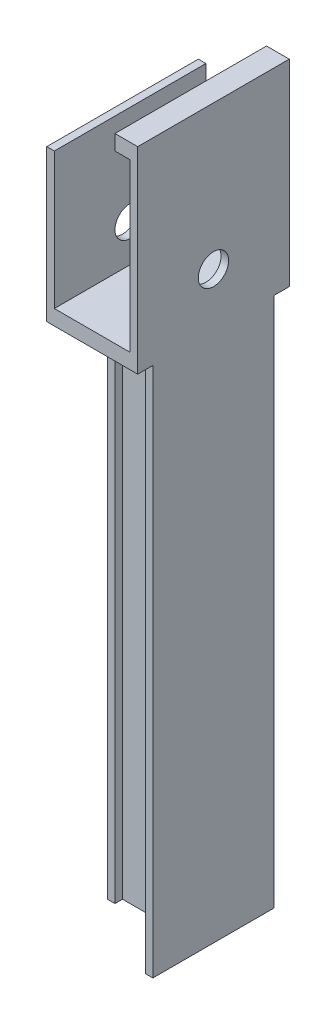
ISO-10303-21;
HEADER;
FILE_DESCRIPTION(('STEP AP214'),'2;1');
FILE_NAME('part.step','',(''),(''),'','','');
FILE_SCHEMA(('AUTOMOTIVE_DESIGN { 1 0 10303 214 1 1 1 1 }'));
ENDSEC;
DATA;
#1=APPLICATION_CONTEXT('core data for automotive mechanical design processes');
#2=APPLICATION_PROTOCOL_DEFINITION('international standard','automotive_design',2000,#1);
#3=PRODUCT_CONTEXT('',#1,'mechanical');
#4=PRODUCT('Part','Part','',(#3));
#5=PRODUCT_RELATED_PRODUCT_CATEGORY('part','',(#4));
#6=PRODUCT_DEFINITION_FORMATION('','',#4);
#7=PRODUCT_DEFINITION_CONTEXT('part definition',#1,'design');
#8=PRODUCT_DEFINITION('design','',#6,#7);
#9=PRODUCT_DEFINITION_SHAPE('','',#8);
#10=(LENGTH_UNIT() NAMED_UNIT(*) SI_UNIT(.MILLI.,.METRE.));
#11=(NAMED_UNIT(*) PLANE_ANGLE_UNIT() SI_UNIT($,.RADIAN.));
#12=(NAMED_UNIT(*) SI_UNIT($,.STERADIAN.) SOLID_ANGLE_UNIT());
#13=UNCERTAINTY_MEASURE_WITH_UNIT(LENGTH_MEASURE(1.E-05),#10,'distance_accuracy_value','');
#14=(GEOMETRIC_REPRESENTATION_CONTEXT(3) GLOBAL_UNCERTAINTY_ASSIGNED_CONTEXT((#13)) GLOBAL_UNIT_ASSIGNED_CONTEXT((#10,
#11,#12)) REPRESENTATION_CONTEXT('',''));
#15=CARTESIAN_POINT('',(0.,0.,0.));
#16=DIRECTION('',(0.,0.,1.));
#17=DIRECTION('',(1.,0.,0.));
#18=AXIS2_PLACEMENT_3D('',#15,#16,#17);
#19=CARTESIAN_POINT('',(-70.7317073170732,-350.,-89.2682926829269));
#20=DIRECTION('',(0.,0.,1.));
#21=DIRECTION('',(1.,0.,0.));
#22=AXIS2_PLACEMENT_3D('',#19,#20,#21);
#23=PLANE('',#22);
#24=DIRECTION('',(1.,0.,0.));
#25=VECTOR('',#24,1.);
#26=CARTESIAN_POINT('',(-70.7317073170732,-350.,-89.2682926829269));
#27=LINE('',#26,#25);
#28=CARTESIAN_POINT('',(-75.7317073170732,-350.,-89.2682926829269));
#29=VERTEX_POINT('',#28);
#30=CARTESIAN_POINT('',(-70.7317073170732,-350.,-89.2682926829269));
#31=VERTEX_POINT('',#30);
#32=EDGE_CURVE('E299',#29,#31,#27,.T.);
#33=ORIENTED_EDGE('',*,*,#32,.F.);
#34=DIRECTION('',(0.,-1.,0.));
#35=VECTOR('',#34,1.);
#36=CARTESIAN_POINT('',(-75.7317073170732,0.,-89.2682926829269));
#37=LINE('',#36,#35);
#38=CARTESIAN_POINT('',(-75.7317073170732,0.,-89.2682926829269));
#39=VERTEX_POINT('',#38);
#40=EDGE_CURVE('E212',#39,#29,#37,.T.);
#41=ORIENTED_EDGE('',*,*,#40,.F.);
#42=DIRECTION('',(1.,0.,0.));
#43=VECTOR('',#42,1.);
#44=CARTESIAN_POINT('',(-70.7317073170732,0.,-89.2682926829269));
#45=LINE('',#44,#43);
#46=CARTESIAN_POINT('',(-70.7317073170732,0.,-89.2682926829269));
#47=VERTEX_POINT('',#46);
#48=EDGE_CURVE('E295',#39,#47,#45,.T.);
#49=ORIENTED_EDGE('',*,*,#48,.T.);
#50=DIRECTION('',(0.,1.,0.));
#51=VECTOR('',#50,1.);
#52=CARTESIAN_POINT('',(-70.7317073170732,-350.,-89.2682926829269));
#53=LINE('',#52,#51);
#54=EDGE_CURVE('E301',#31,#47,#53,.T.);
#55=ORIENTED_EDGE('',*,*,#54,.F.);
#56=EDGE_LOOP('',(#33,#41,#49,#55));
#57=FACE_BOUND('',#56,.T.);
#58=ADVANCED_FACE('F39',(#57),#23,.F.);
#59=CARTESIAN_POINT('',(0.,0.,0.));
#60=DIRECTION('',(0.,1.,0.));
#61=DIRECTION('',(0.,0.,1.));
#62=AXIS2_PLACEMENT_3D('',#59,#60,#61);
#63=PLANE('',#62);
#64=DIRECTION('',(-1.,0.,0.));
#65=VECTOR('',#64,1.);
#66=CARTESIAN_POINT('',(-125.731707317073,0.,-59.2682926829269));
#67=LINE('',#66,#65);
#68=CARTESIAN_POINT('',(-125.731707317073,0.,-59.2682926829269));
#69=VERTEX_POINT('',#68);
#70=CARTESIAN_POINT('',(-130.731707317073,0.,-59.2682926829269));
#71=VERTEX_POINT('',#70);
#72=EDGE_CURVE('E218',#69,#71,#67,.T.);
#73=ORIENTED_EDGE('',*,*,#72,.T.);
#74=DIRECTION('',(0.,0.,1.));
#75=VECTOR('',#74,1.);
#76=CARTESIAN_POINT('',(-130.731707317073,0.,-99.2682926829269));
#77=LINE('',#76,#75);
#78=CARTESIAN_POINT('',(-130.731707317073,0.,-99.2682926829269));
#79=VERTEX_POINT('',#78);
#80=EDGE_CURVE('E196',#79,#71,#77,.T.);
#81=ORIENTED_EDGE('',*,*,#80,.F.);
#82=DIRECTION('',(-1.,0.,0.));
#83=VECTOR('',#82,1.);
#84=CARTESIAN_POINT('',(-130.731707317073,0.,-99.2682926829269));
#85=LINE('',#84,#83);
#86=CARTESIAN_POINT('',(-70.7317073170732,0.,-99.2682926829269));
#87=VERTEX_POINT('',#86);
#88=EDGE_CURVE('E352',#87,#79,#85,.T.);
#89=ORIENTED_EDGE('',*,*,#88,.F.);
#90=DIRECTION('',(0.,0.,-1.));
#91=VECTOR('',#90,1.);
#92=CARTESIAN_POINT('',(-70.7317073170732,0.,-99.2682926829269));
#93=LINE('',#92,#91);
#94=EDGE_CURVE('E359',#47,#87,#93,.T.);
#95=ORIENTED_EDGE('',*,*,#94,.F.);
#96=ORIENTED_EDGE('',*,*,#48,.F.);
#97=DIRECTION('',(0.,0.,1.));
#98=VECTOR('',#97,1.);
#99=CARTESIAN_POINT('',(-75.7317073170732,0.,-54.2682926829269));
#100=LINE('',#99,#98);
#101=CARTESIAN_POINT('',(-75.7317073170732,0.,-54.2682926829269));
#102=VERTEX_POINT('',#101);
#103=EDGE_CURVE('E259',#39,#102,#100,.T.);
#104=ORIENTED_EDGE('',*,*,#103,.T.);
#105=DIRECTION('',(-1.,0.,0.));
#106=VECTOR('',#105,1.);
#107=CARTESIAN_POINT('',(-125.731707317073,0.,-54.2682926829269));
#108=LINE('',#107,#106);
#109=CARTESIAN_POINT('',(-125.731707317073,0.,-54.2682926829269));
#110=VERTEX_POINT('',#109);
#111=EDGE_CURVE('E265',#102,#110,#108,.T.);
#112=ORIENTED_EDGE('',*,*,#111,.T.);
#113=DIRECTION('',(0.,0.,-1.));
#114=VECTOR('',#113,1.);
#115=CARTESIAN_POINT('',(-125.731707317073,0.,-54.2682926829269));
#116=LINE('',#115,#114);
#117=EDGE_CURVE('E251',#110,#69,#116,.T.);
#118=ORIENTED_EDGE('',*,*,#117,.T.);
#119=EDGE_LOOP('',(#73,#81,#89,#95,#96,#104,#112,#118));
#120=FACE_BOUND('',#119,.T.);
#121=ADVANCED_FACE('F392',(#120),#63,.F.);
#122=CARTESIAN_POINT('',(-130.731707317073,0.,-39.2682926829269));
#123=VERTEX_POINT('',#122);
#124=CARTESIAN_POINT('',(-130.731707317073,0.,0.73170731707313));
#125=VERTEX_POINT('',#124);
#126=EDGE_CURVE('E189',#123,#125,#77,.T.);
#127=ORIENTED_EDGE('',*,*,#126,.F.);
#128=DIRECTION('',(1.,0.,0.));
#129=VECTOR('',#128,1.);
#130=CARTESIAN_POINT('',(-125.731707317073,0.,-39.2682926829269));
#131=LINE('',#130,#129);
#132=CARTESIAN_POINT('',(-125.731707317073,0.,-39.2682926829269));
#133=VERTEX_POINT('',#132);
#134=EDGE_CURVE('E55',#123,#133,#131,.T.);
#135=ORIENTED_EDGE('',*,*,#134,.T.);
#136=DIRECTION('',(0.,0.,-1.));
#137=VECTOR('',#136,1.);
#138=CARTESIAN_POINT('',(-125.731707317073,0.,-9.26829268292688));
#139=LINE('',#138,#137);
#140=CARTESIAN_POINT('',(-125.731707317073,0.,-44.2682926829269));
#141=VERTEX_POINT('',#140);
#142=EDGE_CURVE('E225',#133,#141,#139,.T.);
#143=ORIENTED_EDGE('',*,*,#142,.T.);
#144=DIRECTION('',(1.,0.,0.));
#145=VECTOR('',#144,1.);
#146=CARTESIAN_POINT('',(-125.731707317073,0.,-44.2682926829269));
#147=LINE('',#146,#145);
#148=CARTESIAN_POINT('',(-75.7317073170732,0.,-44.2682926829269));
#149=VERTEX_POINT('',#148);
#150=EDGE_CURVE('E227',#141,#149,#147,.T.);
#151=ORIENTED_EDGE('',*,*,#150,.T.);
#152=DIRECTION('',(0.,0.,1.));
#153=VECTOR('',#152,1.);
#154=CARTESIAN_POINT('',(-75.7317073170732,0.,-9.26829268292687));
#155=LINE('',#154,#153);
#156=CARTESIAN_POINT('',(-75.7317073170732,0.,-9.26829268292687));
#157=VERTEX_POINT('',#156);
#158=EDGE_CURVE('E231',#149,#157,#155,.T.);
#159=ORIENTED_EDGE('',*,*,#158,.T.);
#160=DIRECTION('',(-1.,0.,0.));
#161=VECTOR('',#160,1.);
#162=CARTESIAN_POINT('',(-70.7317073170732,0.,-9.26829268292688));
#163=LINE('',#162,#161);
#164=CARTESIAN_POINT('',(-70.7317073170732,0.,-9.26829268292688));
#165=VERTEX_POINT('',#164);
#166=EDGE_CURVE('E290',#165,#157,#163,.T.);
#167=ORIENTED_EDGE('',*,*,#166,.F.);
#168=CARTESIAN_POINT('',(-70.7317073170732,0.,0.73170731707313));
#169=VERTEX_POINT('',#168);
#170=EDGE_CURVE('E360',#169,#165,#93,.T.);
#171=ORIENTED_EDGE('',*,*,#170,.F.);
#172=DIRECTION('',(1.,0.,0.));
#173=VECTOR('',#172,1.);
#174=CARTESIAN_POINT('',(-130.731707317073,0.,0.73170731707313));
#175=LINE('',#174,#173);
#176=EDGE_CURVE('E192',#125,#169,#175,.T.);
#177=ORIENTED_EDGE('',*,*,#176,.F.);
#178=EDGE_LOOP('',(#127,#135,#143,#151,#159,#167,#171,#177));
#179=FACE_BOUND('',#178,.T.);
#180=ADVANCED_FACE('F190',(#179),#63,.F.);
#181=CARTESIAN_POINT('',(-75.7317073170732,60.,-99.2682926829269));
#182=DIRECTION('',(1.,0.,0.));
#183=DIRECTION('',(0.,0.,-1.));
#184=AXIS2_PLACEMENT_3D('',#181,#182,#183);
#185=PLANE('',#184);
#186=CARTESIAN_POINT('',(-75.7317073170732,35.,-49.2682926829269));
#187=DIRECTION('',(1.,0.,0.));
#188=DIRECTION('',(0.,0.,-1.));
#189=AXIS2_PLACEMENT_3D('',#186,#187,#188);
#190=CIRCLE('',#189,10.);
#191=CARTESIAN_POINT('',(-75.7317073170732,35.,-59.2682926829269));
#192=VERTEX_POINT('',#191);
#193=EDGE_CURVE('E275',#192,#192,#190,.T.);
#194=ORIENTED_EDGE('',*,*,#193,.T.);
#195=EDGE_LOOP('',(#194));
#196=FACE_BOUND('',#195,.T.);
#197=DIRECTION('',(0.,0.,1.));
#198=VECTOR('',#197,1.);
#199=CARTESIAN_POINT('',(-75.7317073170732,120.,-99.2682926829269));
#200=LINE('',#199,#198);
#201=CARTESIAN_POINT('',(-75.7317073170732,120.,-99.2682926829269));
#202=VERTEX_POINT('',#201);
#203=CARTESIAN_POINT('',(-75.7317073170732,120.,0.73170731707313));
#204=VERTEX_POINT('',#203);
#205=EDGE_CURVE('E310',#202,#204,#200,.T.);
#206=ORIENTED_EDGE('',*,*,#205,.F.);
#207=DIRECTION('',(0.,1.,0.));
#208=VECTOR('',#207,1.);
#209=CARTESIAN_POINT('',(-75.7317073170732,60.,-99.2682926829269));
#210=LINE('',#209,#208);
#211=CARTESIAN_POINT('',(-75.7317073170732,10.,-99.2682926829269));
#212=VERTEX_POINT('',#211);
#213=EDGE_CURVE('E340',#212,#202,#210,.T.);
#214=ORIENTED_EDGE('',*,*,#213,.F.);
#215=DIRECTION('',(0.,0.,-1.));
#216=VECTOR('',#215,1.);
#217=CARTESIAN_POINT('',(-75.7317073170732,10.,-99.2682926829269));
#218=LINE('',#217,#216);
#219=CARTESIAN_POINT('',(-75.7317073170732,10.,0.73170731707313));
#220=VERTEX_POINT('',#219);
#221=EDGE_CURVE('E284',#220,#212,#218,.T.);
#222=ORIENTED_EDGE('',*,*,#221,.F.);
#223=DIRECTION('',(0.,1.,0.));
#224=VECTOR('',#223,1.);
#225=CARTESIAN_POINT('',(-75.7317073170732,60.,0.73170731707313));
#226=LINE('',#225,#224);
#227=EDGE_CURVE('E343',#220,#204,#226,.T.);
#228=ORIENTED_EDGE('',*,*,#227,.T.);
#229=EDGE_LOOP('',(#206,#214,#222,#228));
#230=FACE_BOUND('',#229,.T.);
#231=ADVANCED_FACE('F413',(#196,#230),#185,.F.);
#232=CARTESIAN_POINT('',(0.,100.,0.));
#233=DIRECTION('',(0.,1.,0.));
#234=DIRECTION('',(0.,0.,1.));
#235=AXIS2_PLACEMENT_3D('',#232,#233,#234);
#236=PLANE('',#235);
#237=DIRECTION('',(0.,0.,1.));
#238=VECTOR('',#237,1.);
#239=CARTESIAN_POINT('',(-125.731707317073,100.,-99.2682926829269));
#240=LINE('',#239,#238);
#241=CARTESIAN_POINT('',(-125.731707317073,100.,-99.2682926829269));
#242=VERTEX_POINT('',#241);
#243=CARTESIAN_POINT('',(-125.731707317073,100.,0.73170731707313));
#244=VERTEX_POINT('',#243);
#245=EDGE_CURVE('E336',#242,#244,#240,.T.);
#246=ORIENTED_EDGE('',*,*,#245,.F.);
#247=DIRECTION('',(-1.,0.,0.));
#248=VECTOR('',#247,1.);
#249=CARTESIAN_POINT('',(-130.731707317073,100.,-99.2682926829269));
#250=LINE('',#249,#248);
#251=CARTESIAN_POINT('',(-130.731707317073,100.,-99.2682926829269));
#252=VERTEX_POINT('',#251);
#253=EDGE_CURVE('E355',#242,#252,#250,.T.);
#254=ORIENTED_EDGE('',*,*,#253,.T.);
#255=DIRECTION('',(0.,0.,1.));
#256=VECTOR('',#255,1.);
#257=CARTESIAN_POINT('',(-130.731707317073,100.,-99.2682926829269));
#258=LINE('',#257,#256);
#259=CARTESIAN_POINT('',(-130.731707317073,100.,0.73170731707313));
#260=VERTEX_POINT('',#259);
#261=EDGE_CURVE('E348',#252,#260,#258,.T.);
#262=ORIENTED_EDGE('',*,*,#261,.T.);
#263=DIRECTION('',(1.,0.,0.));
#264=VECTOR('',#263,1.);
#265=CARTESIAN_POINT('',(-130.731707317073,100.,0.73170731707313));
#266=LINE('',#265,#264);
#267=EDGE_CURVE('E351',#260,#244,#266,.T.);
#268=ORIENTED_EDGE('',*,*,#267,.T.);
#269=EDGE_LOOP('',(#246,#254,#262,#268));
#270=FACE_BOUND('',#269,.T.);
#271=ADVANCED_FACE('F421',(#270),#236,.T.);
#272=CARTESIAN_POINT('',(-130.731707317073,100.,-99.2682926829269));
#273=DIRECTION('',(1.,0.,0.));
#274=DIRECTION('',(0.,0.,-1.));
#275=AXIS2_PLACEMENT_3D('',#272,#273,#274);
#276=PLANE('',#275);
#277=CARTESIAN_POINT('',(-130.731707317073,35.,-49.2682926829269));
#278=DIRECTION('',(-1.,0.,0.));
#279=DIRECTION('',(0.,0.,1.));
#280=AXIS2_PLACEMENT_3D('',#277,#278,#279);
#281=CIRCLE('',#280,10.);
#282=CARTESIAN_POINT('',(-130.731707317073,35.,-39.2682926829269));
#283=VERTEX_POINT('',#282);
#284=EDGE_CURVE('E244',#283,#283,#281,.T.);
#285=ORIENTED_EDGE('',*,*,#284,.F.);
#286=EDGE_LOOP('',(#285));
#287=FACE_BOUND('',#286,.T.);
#288=DIRECTION('',(0.,0.,-1.));
#289=VECTOR('',#288,1.);
#290=CARTESIAN_POINT('',(-130.731707317073,-350.,-89.2682926829269));
#291=LINE('',#290,#289);
#292=CARTESIAN_POINT('',(-130.731707317073,-350.,-39.2682926829269));
#293=VERTEX_POINT('',#292);
#294=CARTESIAN_POINT('',(-130.731707317073,-350.,-59.2682926829269));
#295=VERTEX_POINT('',#294);
#296=EDGE_CURVE('E210',#293,#295,#291,.T.);
#297=ORIENTED_EDGE('',*,*,#296,.F.);
#298=DIRECTION('',(0.,-1.,0.));
#299=VECTOR('',#298,1.);
#300=CARTESIAN_POINT('',(-130.731707317073,0.,-39.2682926829269));
#301=LINE('',#300,#299);
#302=EDGE_CURVE('E201',#123,#293,#301,.T.);
#303=ORIENTED_EDGE('',*,*,#302,.F.);
#304=ORIENTED_EDGE('',*,*,#126,.T.);
#305=DIRECTION('',(0.,-1.,0.));
#306=VECTOR('',#305,1.);
#307=CARTESIAN_POINT('',(-130.731707317073,100.,0.73170731707313));
#308=LINE('',#307,#306);
#309=EDGE_CURVE('E11',#260,#125,#308,.T.);
#310=ORIENTED_EDGE('',*,*,#309,.F.);
#311=ORIENTED_EDGE('',*,*,#261,.F.);
#312=DIRECTION('',(0.,-1.,0.));
#313=VECTOR('',#312,1.);
#314=CARTESIAN_POINT('',(-130.731707317073,100.,-99.2682926829269));
#315=LINE('',#314,#313);
#316=EDGE_CURVE('E356',#252,#79,#315,.T.);
#317=ORIENTED_EDGE('',*,*,#316,.T.);
#318=ORIENTED_EDGE('',*,*,#80,.T.);
#319=DIRECTION('',(0.,-1.,0.));
#320=VECTOR('',#319,1.);
#321=CARTESIAN_POINT('',(-130.731707317073,0.,-59.2682926829269));
#322=LINE('',#321,#320);
#323=EDGE_CURVE('E219',#71,#295,#322,.T.);
#324=ORIENTED_EDGE('',*,*,#323,.T.);
#325=EDGE_LOOP('',(#297,#303,#304,#310,#311,#317,#318,#324));
#326=FACE_BOUND('',#325,.T.);
#327=ADVANCED_FACE('F41',(#287,#326),#276,.F.);
#328=CARTESIAN_POINT('',(-130.731707317073,100.,0.73170731707313));
#329=DIRECTION('',(0.,0.,-1.));
#330=DIRECTION('',(-1.,0.,0.));
#331=AXIS2_PLACEMENT_3D('',#328,#329,#330);
#332=PLANE('',#331);
#333=DIRECTION('',(1.,0.,0.));
#334=VECTOR('',#333,1.);
#335=CARTESIAN_POINT('',(-125.731707317073,10.,0.73170731707313));
#336=LINE('',#335,#334);
#337=CARTESIAN_POINT('',(-125.731707317073,10.,0.73170731707313));
#338=VERTEX_POINT('',#337);
#339=EDGE_CURVE('E281',#338,#220,#336,.T.);
#340=ORIENTED_EDGE('',*,*,#339,.F.);
#341=DIRECTION('',(0.,1.,0.));
#342=VECTOR('',#341,1.);
#343=CARTESIAN_POINT('',(-125.731707317073,60.,0.73170731707313));
#344=LINE('',#343,#342);
#345=EDGE_CURVE('E338',#338,#244,#344,.T.);
#346=ORIENTED_EDGE('',*,*,#345,.T.);
#347=ORIENTED_EDGE('',*,*,#267,.F.);
#348=ORIENTED_EDGE('',*,*,#309,.T.);
#349=ORIENTED_EDGE('',*,*,#176,.T.);
#350=DIRECTION('',(0.,-1.,0.));
#351=VECTOR('',#350,1.);
#352=CARTESIAN_POINT('',(-70.7317073170732,100.,0.73170731707313));
#353=LINE('',#352,#351);
#354=CARTESIAN_POINT('',(-70.7317073170732,130.,0.73170731707313));
#355=VERTEX_POINT('',#354);
#356=EDGE_CURVE('E48',#355,#169,#353,.T.);
#357=ORIENTED_EDGE('',*,*,#356,.F.);
#358=DIRECTION('',(1.,0.,0.));
#359=VECTOR('',#358,1.);
#360=CARTESIAN_POINT('',(-75.7317073170732,130.,0.73170731707313));
#361=LINE('',#360,#359);
#362=CARTESIAN_POINT('',(-85.7317073170732,130.,0.731707317073128));
#363=VERTEX_POINT('',#362);
#364=EDGE_CURVE('E328',#363,#355,#361,.T.);
#365=ORIENTED_EDGE('',*,*,#364,.F.);
#366=DIRECTION('',(0.,1.,0.));
#367=VECTOR('',#366,1.);
#368=CARTESIAN_POINT('',(-85.7317073170732,130.,0.731707317073128));
#369=LINE('',#368,#367);
#370=CARTESIAN_POINT('',(-85.7317073170732,120.,0.731707317073131));
#371=VERTEX_POINT('',#370);
#372=EDGE_CURVE('E316',#371,#363,#369,.T.);
#373=ORIENTED_EDGE('',*,*,#372,.F.);
#374=DIRECTION('',(1.,0.,0.));
#375=VECTOR('',#374,1.);
#376=CARTESIAN_POINT('',(-85.7317073170732,120.,0.731707317073131));
#377=LINE('',#376,#375);
#378=EDGE_CURVE('E322',#371,#204,#377,.T.);
#379=ORIENTED_EDGE('',*,*,#378,.T.);
#380=ORIENTED_EDGE('',*,*,#227,.F.);
#381=EDGE_LOOP('',(#340,#346,#347,#348,#349,#357,#365,#373,#379,#380));
#382=FACE_BOUND('',#381,.T.);
#383=ADVANCED_FACE('F408',(#382),#332,.F.);
#384=CARTESIAN_POINT('',(-70.7317073170732,100.,-99.2682926829269));
#385=DIRECTION('',(-1.,0.,0.));
#386=DIRECTION('',(0.,0.,1.));
#387=AXIS2_PLACEMENT_3D('',#384,#385,#386);
#388=PLANE('',#387);
#389=CARTESIAN_POINT('',(-70.7317073170732,35.,-49.2682926829269));
#390=DIRECTION('',(-1.,0.,0.));
#391=DIRECTION('',(0.,0.,1.));
#392=AXIS2_PLACEMENT_3D('',#389,#390,#391);
#393=CIRCLE('',#392,10.);
#394=CARTESIAN_POINT('',(-70.7317073170732,35.,-39.2682926829269));
#395=VERTEX_POINT('',#394);
#396=EDGE_CURVE('E272',#395,#395,#393,.T.);
#397=ORIENTED_EDGE('',*,*,#396,.T.);
#398=EDGE_LOOP('',(#397));
#399=FACE_BOUND('',#398,.T.);
#400=ORIENTED_EDGE('',*,*,#170,.T.);
#401=DIRECTION('',(0.,1.,0.));
#402=VECTOR('',#401,1.);
#403=CARTESIAN_POINT('',(-70.7317073170732,-350.,-9.26829268292688));
#404=LINE('',#403,#402);
#405=CARTESIAN_POINT('',(-70.7317073170732,-350.,-9.26829268292688));
#406=VERTEX_POINT('',#405);
#407=EDGE_CURVE('E307',#406,#165,#404,.T.);
#408=ORIENTED_EDGE('',*,*,#407,.F.);
#409=DIRECTION('',(0.,0.,1.));
#410=VECTOR('',#409,1.);
#411=CARTESIAN_POINT('',(-70.7317073170732,-350.,-89.2682926829269));
#412=LINE('',#411,#410);
#413=EDGE_CURVE('E291',#31,#406,#412,.T.);
#414=ORIENTED_EDGE('',*,*,#413,.F.);
#415=ORIENTED_EDGE('',*,*,#54,.T.);
#416=ORIENTED_EDGE('',*,*,#94,.T.);
#417=DIRECTION('',(0.,-1.,0.));
#418=VECTOR('',#417,1.);
#419=CARTESIAN_POINT('',(-70.7317073170732,100.,-99.2682926829269));
#420=LINE('',#419,#418);
#421=CARTESIAN_POINT('',(-70.7317073170732,130.,-99.2682926829269));
#422=VERTEX_POINT('',#421);
#423=EDGE_CURVE('E366',#422,#87,#420,.T.);
#424=ORIENTED_EDGE('',*,*,#423,.F.);
#425=DIRECTION('',(0.,0.,-1.));
#426=VECTOR('',#425,1.);
#427=CARTESIAN_POINT('',(-70.7317073170732,130.,-99.2682926829269));
#428=LINE('',#427,#426);
#429=EDGE_CURVE('E331',#355,#422,#428,.T.);
#430=ORIENTED_EDGE('',*,*,#429,.F.);
#431=ORIENTED_EDGE('',*,*,#356,.T.);
#432=EDGE_LOOP('',(#400,#408,#414,#415,#416,#424,#430,#431));
#433=FACE_BOUND('',#432,.T.);
#434=ADVANCED_FACE('F372',(#399,#433),#388,.F.);
#435=CARTESIAN_POINT('',(-130.731707317073,100.,-99.2682926829269));
#436=DIRECTION('',(0.,0.,1.));
#437=DIRECTION('',(1.,0.,0.));
#438=AXIS2_PLACEMENT_3D('',#435,#436,#437);
#439=PLANE('',#438);
#440=DIRECTION('',(0.,1.,0.));
#441=VECTOR('',#440,1.);
#442=CARTESIAN_POINT('',(-125.731707317073,60.,-99.2682926829269));
#443=LINE('',#442,#441);
#444=CARTESIAN_POINT('',(-125.731707317073,10.,-99.2682926829269));
#445=VERTEX_POINT('',#444);
#446=EDGE_CURVE('E197',#445,#242,#443,.T.);
#447=ORIENTED_EDGE('',*,*,#446,.F.);
#448=DIRECTION('',(-1.,0.,0.));
#449=VECTOR('',#448,1.);
#450=CARTESIAN_POINT('',(-125.731707317073,10.,-99.2682926829269));
#451=LINE('',#450,#449);
#452=EDGE_CURVE('E287',#212,#445,#451,.T.);
#453=ORIENTED_EDGE('',*,*,#452,.F.);
#454=ORIENTED_EDGE('',*,*,#213,.T.);
#455=DIRECTION('',(1.,0.,0.));
#456=VECTOR('',#455,1.);
#457=CARTESIAN_POINT('',(-85.7317073170732,120.,-99.2682926829269));
#458=LINE('',#457,#456);
#459=CARTESIAN_POINT('',(-85.7317073170732,120.,-99.2682926829269));
#460=VERTEX_POINT('',#459);
#461=EDGE_CURVE('E326',#460,#202,#458,.T.);
#462=ORIENTED_EDGE('',*,*,#461,.F.);
#463=DIRECTION('',(0.,-1.,0.));
#464=VECTOR('',#463,1.);
#465=CARTESIAN_POINT('',(-85.7317073170732,130.,-99.2682926829269));
#466=LINE('',#465,#464);
#467=CARTESIAN_POINT('',(-85.7317073170732,130.,-99.2682926829269));
#468=VERTEX_POINT('',#467);
#469=EDGE_CURVE('E311',#468,#460,#466,.T.);
#470=ORIENTED_EDGE('',*,*,#469,.F.);
#471=DIRECTION('',(-1.,0.,0.));
#472=VECTOR('',#471,1.);
#473=CARTESIAN_POINT('',(-75.7317073170732,130.,-99.2682926829269));
#474=LINE('',#473,#472);
#475=EDGE_CURVE('E334',#422,#468,#474,.T.);
#476=ORIENTED_EDGE('',*,*,#475,.F.);
#477=ORIENTED_EDGE('',*,*,#423,.T.);
#478=ORIENTED_EDGE('',*,*,#88,.T.);
#479=ORIENTED_EDGE('',*,*,#316,.F.);
#480=ORIENTED_EDGE('',*,*,#253,.F.);
#481=EDGE_LOOP('',(#447,#453,#454,#462,#470,#476,#477,#478,#479,#480));
#482=FACE_BOUND('',#481,.T.);
#483=ADVANCED_FACE('F396',(#482),#439,.F.);
#484=CARTESIAN_POINT('',(-125.731707317073,60.,-99.2682926829269));
#485=DIRECTION('',(-1.,0.,0.));
#486=DIRECTION('',(0.,0.,1.));
#487=AXIS2_PLACEMENT_3D('',#484,#485,#486);
#488=PLANE('',#487);
#489=CARTESIAN_POINT('',(-125.731707317073,35.,-49.2682926829269));
#490=DIRECTION('',(-1.,0.,0.));
#491=DIRECTION('',(0.,0.,1.));
#492=AXIS2_PLACEMENT_3D('',#489,#490,#491);
#493=CIRCLE('',#492,10.);
#494=CARTESIAN_POINT('',(-125.731707317073,35.,-39.2682926829269));
#495=VERTEX_POINT('',#494);
#496=EDGE_CURVE('E43',#495,#495,#493,.T.);
#497=ORIENTED_EDGE('',*,*,#496,.T.);
#498=EDGE_LOOP('',(#497));
#499=FACE_BOUND('',#498,.T.);
#500=ORIENTED_EDGE('',*,*,#245,.T.);
#501=ORIENTED_EDGE('',*,*,#345,.F.);
#502=DIRECTION('',(0.,0.,1.));
#503=VECTOR('',#502,1.);
#504=CARTESIAN_POINT('',(-125.731707317073,10.,-99.2682926829269));
#505=LINE('',#504,#503);
#506=EDGE_CURVE('E278',#445,#338,#505,.T.);
#507=ORIENTED_EDGE('',*,*,#506,.F.);
#508=ORIENTED_EDGE('',*,*,#446,.T.);
#509=EDGE_LOOP('',(#500,#501,#507,#508));
#510=FACE_BOUND('',#509,.T.);
#511=ADVANCED_FACE('F470',(#499,#510),#488,.F.);
#512=CARTESIAN_POINT('',(0.,130.,0.));
#513=DIRECTION('',(0.,1.,0.));
#514=DIRECTION('',(0.,0.,1.));
#515=AXIS2_PLACEMENT_3D('',#512,#513,#514);
#516=PLANE('',#515);
#517=ORIENTED_EDGE('',*,*,#475,.T.);
#518=DIRECTION('',(0.,0.,-1.));
#519=VECTOR('',#518,1.);
#520=CARTESIAN_POINT('',(-85.7317073170732,130.,-99.2682926829269));
#521=LINE('',#520,#519);
#522=EDGE_CURVE('E319',#363,#468,#521,.T.);
#523=ORIENTED_EDGE('',*,*,#522,.F.);
#524=ORIENTED_EDGE('',*,*,#364,.T.);
#525=ORIENTED_EDGE('',*,*,#429,.T.);
#526=EDGE_LOOP('',(#517,#523,#524,#525));
#527=FACE_BOUND('',#526,.T.);
#528=ADVANCED_FACE('F402',(#527),#516,.T.);
#529=CARTESIAN_POINT('',(-85.7317073170732,120.,-99.2682926829269));
#530=DIRECTION('',(0.,1.,0.));
#531=DIRECTION('',(0.,0.,1.));
#532=AXIS2_PLACEMENT_3D('',#529,#530,#531);
#533=PLANE('',#532);
#534=ORIENTED_EDGE('',*,*,#205,.T.);
#535=ORIENTED_EDGE('',*,*,#378,.F.);
#536=DIRECTION('',(0.,0.,1.));
#537=VECTOR('',#536,1.);
#538=CARTESIAN_POINT('',(-85.7317073170732,120.,-99.2682926829269));
#539=LINE('',#538,#537);
#540=EDGE_CURVE('E314',#460,#371,#539,.T.);
#541=ORIENTED_EDGE('',*,*,#540,.F.);
#542=ORIENTED_EDGE('',*,*,#461,.T.);
#543=EDGE_LOOP('',(#534,#535,#541,#542));
#544=FACE_BOUND('',#543,.T.);
#545=ADVANCED_FACE('F465',(#544),#533,.F.);
#546=CARTESIAN_POINT('',(-85.7317073170732,0.,0.));
#547=DIRECTION('',(-1.,0.,0.));
#548=DIRECTION('',(0.,0.,1.));
#549=AXIS2_PLACEMENT_3D('',#546,#547,#548);
#550=PLANE('',#549);
#551=ORIENTED_EDGE('',*,*,#469,.T.);
#552=ORIENTED_EDGE('',*,*,#540,.T.);
#553=ORIENTED_EDGE('',*,*,#372,.T.);
#554=ORIENTED_EDGE('',*,*,#522,.T.);
#555=EDGE_LOOP('',(#551,#552,#553,#554));
#556=FACE_BOUND('',#555,.T.);
#557=ADVANCED_FACE('F404',(#556),#550,.T.);
#558=CARTESIAN_POINT('',(-70.7317073170732,-350.,-9.26829268292688));
#559=DIRECTION('',(0.,0.,-1.));
#560=DIRECTION('',(-1.,0.,0.));
#561=AXIS2_PLACEMENT_3D('',#558,#559,#560);
#562=PLANE('',#561);
#563=ORIENTED_EDGE('',*,*,#166,.T.);
#564=DIRECTION('',(0.,-1.,0.));
#565=VECTOR('',#564,1.);
#566=CARTESIAN_POINT('',(-75.7317073170732,0.,-9.26829268292687));
#567=LINE('',#566,#565);
#568=CARTESIAN_POINT('',(-75.7317073170732,-350.,-9.26829268292687));
#569=VERTEX_POINT('',#568);
#570=EDGE_CURVE('E241',#157,#569,#567,.T.);
#571=ORIENTED_EDGE('',*,*,#570,.T.);
#572=DIRECTION('',(-1.,0.,0.));
#573=VECTOR('',#572,1.);
#574=CARTESIAN_POINT('',(-70.7317073170732,-350.,-9.26829268292688));
#575=LINE('',#574,#573);
#576=EDGE_CURVE('E294',#406,#569,#575,.T.);
#577=ORIENTED_EDGE('',*,*,#576,.F.);
#578=ORIENTED_EDGE('',*,*,#407,.T.);
#579=EDGE_LOOP('',(#563,#571,#577,#578));
#580=FACE_BOUND('',#579,.T.);
#581=ADVANCED_FACE('F377',(#580),#562,.F.);
#582=CARTESIAN_POINT('',(0.,-350.,0.));
#583=DIRECTION('',(0.,-1.,0.));
#584=DIRECTION('',(0.,0.,-1.));
#585=AXIS2_PLACEMENT_3D('',#582,#583,#584);
#586=PLANE('',#585);
#587=DIRECTION('',(1.,0.,0.));
#588=VECTOR('',#587,1.);
#589=CARTESIAN_POINT('',(-125.731707317073,-350.,-39.2682926829269));
#590=LINE('',#589,#588);
#591=CARTESIAN_POINT('',(-125.731707317073,-350.,-39.2682926829269));
#592=VERTEX_POINT('',#591);
#593=EDGE_CURVE('E205',#293,#592,#590,.T.);
#594=ORIENTED_EDGE('',*,*,#593,.F.);
#595=ORIENTED_EDGE('',*,*,#296,.T.);
#596=DIRECTION('',(-1.,0.,0.));
#597=VECTOR('',#596,1.);
#598=CARTESIAN_POINT('',(-125.731707317073,-350.,-59.2682926829269));
#599=LINE('',#598,#597);
#600=CARTESIAN_POINT('',(-125.731707317073,-350.,-59.2682926829269));
#601=VERTEX_POINT('',#600);
#602=EDGE_CURVE('E221',#601,#295,#599,.T.);
#603=ORIENTED_EDGE('',*,*,#602,.F.);
#604=DIRECTION('',(0.,0.,-1.));
#605=VECTOR('',#604,1.);
#606=CARTESIAN_POINT('',(-125.731707317073,-350.,-54.2682926829269));
#607=LINE('',#606,#605);
#608=CARTESIAN_POINT('',(-125.731707317073,-350.,-54.2682926829269));
#609=VERTEX_POINT('',#608);
#610=EDGE_CURVE('E255',#609,#601,#607,.T.);
#611=ORIENTED_EDGE('',*,*,#610,.F.);
#612=DIRECTION('',(-1.,0.,0.));
#613=VECTOR('',#612,1.);
#614=CARTESIAN_POINT('',(-125.731707317073,-350.,-54.2682926829269));
#615=LINE('',#614,#613);
#616=CARTESIAN_POINT('',(-75.7317073170732,-350.,-54.2682926829269));
#617=VERTEX_POINT('',#616);
#618=EDGE_CURVE('E258',#617,#609,#615,.T.);
#619=ORIENTED_EDGE('',*,*,#618,.F.);
#620=DIRECTION('',(0.,0.,1.));
#621=VECTOR('',#620,1.);
#622=CARTESIAN_POINT('',(-75.7317073170732,-350.,-54.2682926829269));
#623=LINE('',#622,#621);
#624=EDGE_CURVE('E237',#29,#617,#623,.T.);
#625=ORIENTED_EDGE('',*,*,#624,.F.);
#626=ORIENTED_EDGE('',*,*,#32,.T.);
#627=ORIENTED_EDGE('',*,*,#413,.T.);
#628=ORIENTED_EDGE('',*,*,#576,.T.);
#629=DIRECTION('',(0.,0.,1.));
#630=VECTOR('',#629,1.);
#631=CARTESIAN_POINT('',(-75.7317073170732,-350.,-9.26829268292687));
#632=LINE('',#631,#630);
#633=CARTESIAN_POINT('',(-75.7317073170732,-350.,-44.2682926829269));
#634=VERTEX_POINT('',#633);
#635=EDGE_CURVE('E228',#634,#569,#632,.T.);
#636=ORIENTED_EDGE('',*,*,#635,.F.);
#637=DIRECTION('',(1.,0.,0.));
#638=VECTOR('',#637,1.);
#639=CARTESIAN_POINT('',(-125.731707317073,-350.,-44.2682926829269));
#640=LINE('',#639,#638);
#641=CARTESIAN_POINT('',(-125.731707317073,-350.,-44.2682926829269));
#642=VERTEX_POINT('',#641);
#643=EDGE_CURVE('E236',#642,#634,#640,.T.);
#644=ORIENTED_EDGE('',*,*,#643,.F.);
#645=DIRECTION('',(0.,0.,-1.));
#646=VECTOR('',#645,1.);
#647=CARTESIAN_POINT('',(-125.731707317073,-350.,-9.26829268292688));
#648=LINE('',#647,#646);
#649=EDGE_CURVE('E63',#592,#642,#648,.T.);
#650=ORIENTED_EDGE('',*,*,#649,.F.);
#651=EDGE_LOOP('',(#594,#595,#603,#611,#619,#625,#626,#627,#628,#636,#644,#650));
#652=FACE_BOUND('',#651,.T.);
#653=ADVANCED_FACE('F381',(#652),#586,.T.);
#654=CARTESIAN_POINT('',(0.,10.,0.));
#655=DIRECTION('',(0.,1.,0.));
#656=DIRECTION('',(0.,0.,1.));
#657=AXIS2_PLACEMENT_3D('',#654,#655,#656);
#658=PLANE('',#657);
#659=ORIENTED_EDGE('',*,*,#506,.T.);
#660=ORIENTED_EDGE('',*,*,#339,.T.);
#661=ORIENTED_EDGE('',*,*,#221,.T.);
#662=ORIENTED_EDGE('',*,*,#452,.T.);
#663=EDGE_LOOP('',(#659,#660,#661,#662));
#664=FACE_BOUND('',#663,.T.);
#665=ADVANCED_FACE('F416',(#664),#658,.T.);
#666=CARTESIAN_POINT('',(-50.7317073170733,35.,-49.2682926829269));
#667=DIRECTION('',(-1.,0.,0.));
#668=DIRECTION('',(0.,0.,1.));
#669=AXIS2_PLACEMENT_3D('',#666,#667,#668);
#670=CYLINDRICAL_SURFACE('',#669,10.);
#671=ORIENTED_EDGE('',*,*,#284,.T.);
#672=EDGE_LOOP('',(#671));
#673=FACE_BOUND('',#672,.T.);
#674=ORIENTED_EDGE('',*,*,#496,.F.);
#675=EDGE_LOOP('',(#674));
#676=FACE_BOUND('',#675,.T.);
#677=ADVANCED_FACE('F494',(#673,#676),#670,.F.);
#678=ORIENTED_EDGE('',*,*,#396,.F.);
#679=EDGE_LOOP('',(#678));
#680=FACE_BOUND('',#679,.T.);
#681=ORIENTED_EDGE('',*,*,#193,.F.);
#682=EDGE_LOOP('',(#681));
#683=FACE_BOUND('',#682,.T.);
#684=ADVANCED_FACE('F497',(#680,#683),#670,.F.);
#685=CARTESIAN_POINT('',(-75.7317073170732,0.,-54.2682926829269));
#686=DIRECTION('',(1.,0.,0.));
#687=DIRECTION('',(0.,0.,-1.));
#688=AXIS2_PLACEMENT_3D('',#685,#686,#687);
#689=PLANE('',#688);
#690=ORIENTED_EDGE('',*,*,#624,.T.);
#691=DIRECTION('',(0.,-1.,0.));
#692=VECTOR('',#691,1.);
#693=CARTESIAN_POINT('',(-75.7317073170732,0.,-54.2682926829269));
#694=LINE('',#693,#692);
#695=EDGE_CURVE('E248',#102,#617,#694,.T.);
#696=ORIENTED_EDGE('',*,*,#695,.F.);
#697=ORIENTED_EDGE('',*,*,#103,.F.);
#698=ORIENTED_EDGE('',*,*,#40,.T.);
#699=EDGE_LOOP('',(#690,#696,#697,#698));
#700=FACE_BOUND('',#699,.T.);
#701=ADVANCED_FACE('F503',(#700),#689,.F.);
#702=CARTESIAN_POINT('',(-125.731707317073,0.,-54.2682926829269));
#703=DIRECTION('',(-1.,0.,0.));
#704=DIRECTION('',(0.,0.,1.));
#705=AXIS2_PLACEMENT_3D('',#702,#703,#704);
#706=PLANE('',#705);
#707=ORIENTED_EDGE('',*,*,#610,.T.);
#708=DIRECTION('',(0.,-1.,0.));
#709=VECTOR('',#708,1.);
#710=CARTESIAN_POINT('',(-125.731707317073,0.,-59.2682926829269));
#711=LINE('',#710,#709);
#712=EDGE_CURVE('E216',#69,#601,#711,.T.);
#713=ORIENTED_EDGE('',*,*,#712,.F.);
#714=ORIENTED_EDGE('',*,*,#117,.F.);
#715=DIRECTION('',(0.,-1.,0.));
#716=VECTOR('',#715,1.);
#717=CARTESIAN_POINT('',(-125.731707317073,0.,-54.2682926829269));
#718=LINE('',#717,#716);
#719=EDGE_CURVE('E252',#110,#609,#718,.T.);
#720=ORIENTED_EDGE('',*,*,#719,.T.);
#721=EDGE_LOOP('',(#707,#713,#714,#720));
#722=FACE_BOUND('',#721,.T.);
#723=ADVANCED_FACE('F431',(#722),#706,.F.);
#724=CARTESIAN_POINT('',(-125.731707317073,0.,-54.2682926829269));
#725=DIRECTION('',(0.,0.,1.));
#726=DIRECTION('',(1.,0.,0.));
#727=AXIS2_PLACEMENT_3D('',#724,#725,#726);
#728=PLANE('',#727);
#729=ORIENTED_EDGE('',*,*,#618,.T.);
#730=ORIENTED_EDGE('',*,*,#719,.F.);
#731=ORIENTED_EDGE('',*,*,#111,.F.);
#732=ORIENTED_EDGE('',*,*,#695,.T.);
#733=EDGE_LOOP('',(#729,#730,#731,#732));
#734=FACE_BOUND('',#733,.T.);
#735=ADVANCED_FACE('F448',(#734),#728,.F.);
#736=CARTESIAN_POINT('',(-125.731707317073,0.,-9.26829268292688));
#737=DIRECTION('',(-1.,0.,0.));
#738=DIRECTION('',(0.,0.,1.));
#739=AXIS2_PLACEMENT_3D('',#736,#737,#738);
#740=PLANE('',#739);
#741=ORIENTED_EDGE('',*,*,#142,.F.);
#742=DIRECTION('',(0.,-1.,0.));
#743=VECTOR('',#742,1.);
#744=CARTESIAN_POINT('',(-125.731707317073,0.,-39.2682926829269));
#745=LINE('',#744,#743);
#746=EDGE_CURVE('E203',#133,#592,#745,.T.);
#747=ORIENTED_EDGE('',*,*,#746,.T.);
#748=ORIENTED_EDGE('',*,*,#649,.T.);
#749=DIRECTION('',(0.,-1.,0.));
#750=VECTOR('',#749,1.);
#751=CARTESIAN_POINT('',(-125.731707317073,0.,-44.2682926829269));
#752=LINE('',#751,#750);
#753=EDGE_CURVE('E234',#141,#642,#752,.T.);
#754=ORIENTED_EDGE('',*,*,#753,.F.);
#755=EDGE_LOOP('',(#741,#747,#748,#754));
#756=FACE_BOUND('',#755,.T.);
#757=ADVANCED_FACE('F434',(#756),#740,.F.);
#758=CARTESIAN_POINT('',(-75.7317073170732,0.,-9.26829268292687));
#759=DIRECTION('',(1.,0.,0.));
#760=DIRECTION('',(0.,0.,-1.));
#761=AXIS2_PLACEMENT_3D('',#758,#759,#760);
#762=PLANE('',#761);
#763=ORIENTED_EDGE('',*,*,#635,.T.);
#764=ORIENTED_EDGE('',*,*,#570,.F.);
#765=ORIENTED_EDGE('',*,*,#158,.F.);
#766=DIRECTION('',(0.,-1.,0.));
#767=VECTOR('',#766,1.);
#768=CARTESIAN_POINT('',(-75.7317073170732,0.,-44.2682926829269));
#769=LINE('',#768,#767);
#770=EDGE_CURVE('E245',#149,#634,#769,.T.);
#771=ORIENTED_EDGE('',*,*,#770,.T.);
#772=EDGE_LOOP('',(#763,#764,#765,#771));
#773=FACE_BOUND('',#772,.T.);
#774=ADVANCED_FACE('F439',(#773),#762,.F.);
#775=CARTESIAN_POINT('',(-125.731707317073,0.,-44.2682926829269));
#776=DIRECTION('',(0.,0.,-1.));
#777=DIRECTION('',(-1.,0.,0.));
#778=AXIS2_PLACEMENT_3D('',#775,#776,#777);
#779=PLANE('',#778);
#780=ORIENTED_EDGE('',*,*,#643,.T.);
#781=ORIENTED_EDGE('',*,*,#770,.F.);
#782=ORIENTED_EDGE('',*,*,#150,.F.);
#783=ORIENTED_EDGE('',*,*,#753,.T.);
#784=EDGE_LOOP('',(#780,#781,#782,#783));
#785=FACE_BOUND('',#784,.T.);
#786=ADVANCED_FACE('F437',(#785),#779,.F.);
#787=CARTESIAN_POINT('',(-125.731707317073,0.,-39.2682926829269));
#788=DIRECTION('',(0.,0.,-1.));
#789=DIRECTION('',(-1.,0.,0.));
#790=AXIS2_PLACEMENT_3D('',#787,#788,#789);
#791=PLANE('',#790);
#792=ORIENTED_EDGE('',*,*,#593,.T.);
#793=ORIENTED_EDGE('',*,*,#746,.F.);
#794=ORIENTED_EDGE('',*,*,#134,.F.);
#795=ORIENTED_EDGE('',*,*,#302,.T.);
#796=EDGE_LOOP('',(#792,#793,#794,#795));
#797=FACE_BOUND('',#796,.T.);
#798=ADVANCED_FACE('F200',(#797),#791,.F.);
#799=CARTESIAN_POINT('',(-125.731707317073,0.,-59.2682926829269));
#800=DIRECTION('',(0.,0.,1.));
#801=DIRECTION('',(1.,0.,0.));
#802=AXIS2_PLACEMENT_3D('',#799,#800,#801);
#803=PLANE('',#802);
#804=ORIENTED_EDGE('',*,*,#602,.T.);
#805=ORIENTED_EDGE('',*,*,#323,.F.);
#806=ORIENTED_EDGE('',*,*,#72,.F.);
#807=ORIENTED_EDGE('',*,*,#712,.T.);
#808=EDGE_LOOP('',(#804,#805,#806,#807));
#809=FACE_BOUND('',#808,.T.);
#810=ADVANCED_FACE('F428',(#809),#803,.F.);
#811=CLOSED_SHELL('',(#58,#121,#180,#231,#271,#327,#383,#434,#483,#511,#528,#545,#557,#581,#653,
#665,#677,#684,#701,#723,#735,#757,#774,#786,#798,#810));
#812=MANIFOLD_SOLID_BREP('B2',#811);
#813=ADVANCED_BREP_SHAPE_REPRESENTATION('',(#18,#812),#14);
#814=SHAPE_DEFINITION_REPRESENTATION(#9,#813);
ENDSEC;
END-ISO-10303-21;
